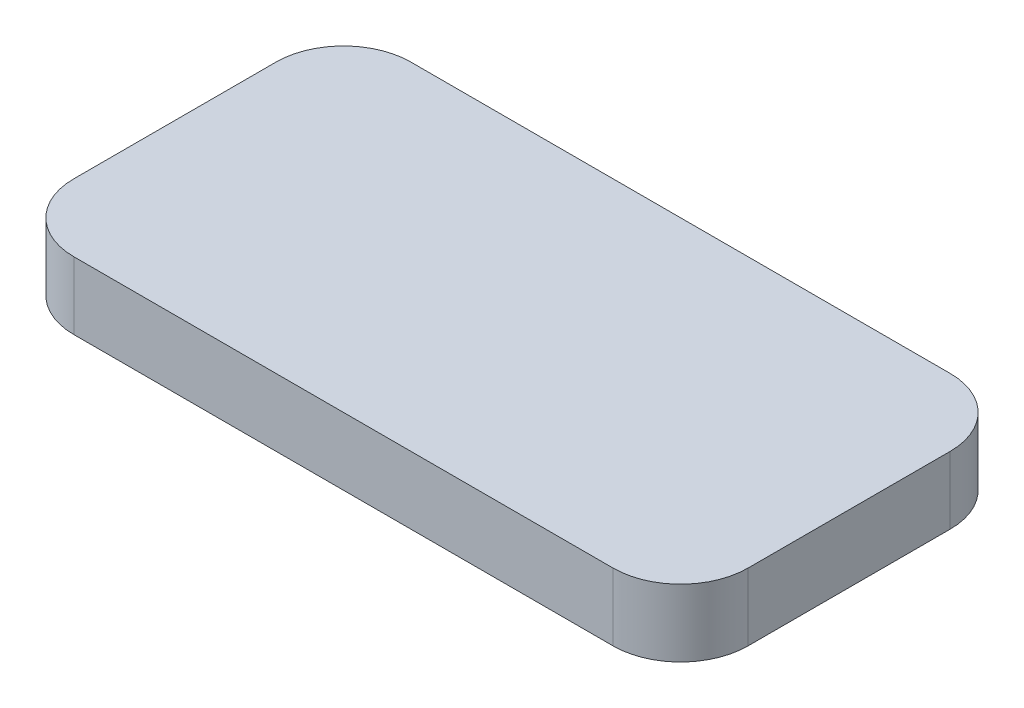
ISO-10303-21;
HEADER;
FILE_DESCRIPTION(('STEP AP214'),'2;1');
FILE_NAME('part.step','',(''),(''),'','','');
FILE_SCHEMA(('AUTOMOTIVE_DESIGN { 1 0 10303 214 1 1 1 1 }'));
ENDSEC;
DATA;
#1=APPLICATION_CONTEXT('core data for automotive mechanical design processes');
#2=APPLICATION_PROTOCOL_DEFINITION('international standard','automotive_design',2000,#1);
#3=PRODUCT_CONTEXT('',#1,'mechanical');
#4=PRODUCT('Part','Part','',(#3));
#5=PRODUCT_RELATED_PRODUCT_CATEGORY('part','',(#4));
#6=PRODUCT_DEFINITION_FORMATION('','',#4);
#7=PRODUCT_DEFINITION_CONTEXT('part definition',#1,'design');
#8=PRODUCT_DEFINITION('design','',#6,#7);
#9=PRODUCT_DEFINITION_SHAPE('','',#8);
#10=(LENGTH_UNIT() NAMED_UNIT(*) SI_UNIT(.MILLI.,.METRE.));
#11=(NAMED_UNIT(*) PLANE_ANGLE_UNIT() SI_UNIT($,.RADIAN.));
#12=(NAMED_UNIT(*) SI_UNIT($,.STERADIAN.) SOLID_ANGLE_UNIT());
#13=UNCERTAINTY_MEASURE_WITH_UNIT(LENGTH_MEASURE(1.E-05),#10,'distance_accuracy_value','');
#14=(GEOMETRIC_REPRESENTATION_CONTEXT(3) GLOBAL_UNCERTAINTY_ASSIGNED_CONTEXT((#13)) GLOBAL_UNIT_ASSIGNED_CONTEXT((#10,
#11,#12)) REPRESENTATION_CONTEXT('',''));
#15=CARTESIAN_POINT('',(0.,0.,0.));
#16=DIRECTION('',(0.,0.,1.));
#17=DIRECTION('',(1.,0.,0.));
#18=AXIS2_PLACEMENT_3D('',#15,#16,#17);
#19=CARTESIAN_POINT('',(50.,10.,25.));
#20=DIRECTION('',(-1.,0.,0.));
#21=DIRECTION('',(0.,0.,1.));
#22=AXIS2_PLACEMENT_3D('',#19,#20,#21);
#23=PLANE('',#22);
#24=DIRECTION('',(0.,0.,-1.));
#25=VECTOR('',#24,1.);
#26=CARTESIAN_POINT('',(50.,0.,25.));
#27=LINE('',#26,#25);
#28=CARTESIAN_POINT('',(50.,0.,15.));
#29=VERTEX_POINT('',#28);
#30=CARTESIAN_POINT('',(50.,0.,-15.));
#31=VERTEX_POINT('',#30);
#32=EDGE_CURVE('E140',#29,#31,#27,.T.);
#33=ORIENTED_EDGE('',*,*,#32,.T.);
#34=DIRECTION('',(0.,-1.,0.));
#35=VECTOR('',#34,1.);
#36=CARTESIAN_POINT('',(50.,10.,-15.));
#37=LINE('',#36,#35);
#38=CARTESIAN_POINT('',(50.,10.,-15.));
#39=VERTEX_POINT('',#38);
#40=EDGE_CURVE('E174',#31,#39,#37,.F.);
#41=ORIENTED_EDGE('',*,*,#40,.T.);
#42=DIRECTION('',(0.,0.,-1.));
#43=VECTOR('',#42,1.);
#44=CARTESIAN_POINT('',(50.,10.,25.));
#45=LINE('',#44,#43);
#46=CARTESIAN_POINT('',(50.,10.,15.));
#47=VERTEX_POINT('',#46);
#48=EDGE_CURVE('E138',#47,#39,#45,.T.);
#49=ORIENTED_EDGE('',*,*,#48,.F.);
#50=DIRECTION('',(0.,-1.,0.));
#51=VECTOR('',#50,1.);
#52=CARTESIAN_POINT('',(50.,10.,15.));
#53=LINE('',#52,#51);
#54=EDGE_CURVE('E170',#47,#29,#53,.T.);
#55=ORIENTED_EDGE('',*,*,#54,.T.);
#56=EDGE_LOOP('',(#33,#41,#49,#55));
#57=FACE_BOUND('',#56,.T.);
#58=ADVANCED_FACE('F39',(#57),#23,.F.);
#59=CARTESIAN_POINT('',(-50.,10.,-25.));
#60=DIRECTION('',(0.,0.,1.));
#61=DIRECTION('',(1.,0.,0.));
#62=AXIS2_PLACEMENT_3D('',#59,#60,#61);
#63=PLANE('',#62);
#64=DIRECTION('',(-1.,0.,0.));
#65=VECTOR('',#64,1.);
#66=CARTESIAN_POINT('',(-50.,0.,-25.));
#67=LINE('',#66,#65);
#68=CARTESIAN_POINT('',(40.,0.,-25.));
#69=VERTEX_POINT('',#68);
#70=CARTESIAN_POINT('',(-40.,0.,-25.));
#71=VERTEX_POINT('',#70);
#72=EDGE_CURVE('E134',#69,#71,#67,.T.);
#73=ORIENTED_EDGE('',*,*,#72,.T.);
#74=DIRECTION('',(0.,-1.,0.));
#75=VECTOR('',#74,1.);
#76=CARTESIAN_POINT('',(-40.,10.,-25.));
#77=LINE('',#76,#75);
#78=CARTESIAN_POINT('',(-40.,10.,-25.));
#79=VERTEX_POINT('',#78);
#80=EDGE_CURVE('E110',#71,#79,#77,.F.);
#81=ORIENTED_EDGE('',*,*,#80,.T.);
#82=DIRECTION('',(-1.,0.,0.));
#83=VECTOR('',#82,1.);
#84=CARTESIAN_POINT('',(-50.,10.,-25.));
#85=LINE('',#84,#83);
#86=CARTESIAN_POINT('',(40.,10.,-25.));
#87=VERTEX_POINT('',#86);
#88=EDGE_CURVE('E193',#87,#79,#85,.T.);
#89=ORIENTED_EDGE('',*,*,#88,.F.);
#90=DIRECTION('',(0.,-1.,0.));
#91=VECTOR('',#90,1.);
#92=CARTESIAN_POINT('',(40.,10.,-25.));
#93=LINE('',#92,#91);
#94=EDGE_CURVE('E116',#87,#69,#93,.T.);
#95=ORIENTED_EDGE('',*,*,#94,.T.);
#96=EDGE_LOOP('',(#73,#81,#89,#95));
#97=FACE_BOUND('',#96,.T.);
#98=ADVANCED_FACE('F214',(#97),#63,.F.);
#99=CARTESIAN_POINT('',(-50.,10.,25.));
#100=DIRECTION('',(1.,0.,0.));
#101=DIRECTION('',(0.,0.,-1.));
#102=AXIS2_PLACEMENT_3D('',#99,#100,#101);
#103=PLANE('',#102);
#104=DIRECTION('',(0.,0.,1.));
#105=VECTOR('',#104,1.);
#106=CARTESIAN_POINT('',(-50.,10.,25.));
#107=LINE('',#106,#105);
#108=CARTESIAN_POINT('',(-50.,10.,-15.));
#109=VERTEX_POINT('',#108);
#110=CARTESIAN_POINT('',(-50.,10.,15.));
#111=VERTEX_POINT('',#110);
#112=EDGE_CURVE('E125',#109,#111,#107,.T.);
#113=ORIENTED_EDGE('',*,*,#112,.F.);
#114=DIRECTION('',(0.,-1.,0.));
#115=VECTOR('',#114,1.);
#116=CARTESIAN_POINT('',(-50.,10.,-15.));
#117=LINE('',#116,#115);
#118=CARTESIAN_POINT('',(-50.,0.,-15.));
#119=VERTEX_POINT('',#118);
#120=EDGE_CURVE('E109',#109,#119,#117,.T.);
#121=ORIENTED_EDGE('',*,*,#120,.T.);
#122=DIRECTION('',(0.,0.,1.));
#123=VECTOR('',#122,1.);
#124=CARTESIAN_POINT('',(-50.,0.,25.));
#125=LINE('',#124,#123);
#126=CARTESIAN_POINT('',(-50.,0.,15.));
#127=VERTEX_POINT('',#126);
#128=EDGE_CURVE('E123',#119,#127,#125,.T.);
#129=ORIENTED_EDGE('',*,*,#128,.T.);
#130=DIRECTION('',(0.,-1.,0.));
#131=VECTOR('',#130,1.);
#132=CARTESIAN_POINT('',(-50.,10.,15.));
#133=LINE('',#132,#131);
#134=EDGE_CURVE('E128',#127,#111,#133,.F.);
#135=ORIENTED_EDGE('',*,*,#134,.T.);
#136=EDGE_LOOP('',(#113,#121,#129,#135));
#137=FACE_BOUND('',#136,.T.);
#138=ADVANCED_FACE('F122',(#137),#103,.F.);
#139=CARTESIAN_POINT('',(-50.,10.,25.));
#140=DIRECTION('',(0.,0.,-1.));
#141=DIRECTION('',(-1.,0.,0.));
#142=AXIS2_PLACEMENT_3D('',#139,#140,#141);
#143=PLANE('',#142);
#144=DIRECTION('',(1.,0.,0.));
#145=VECTOR('',#144,1.);
#146=CARTESIAN_POINT('',(-50.,0.,25.));
#147=LINE('',#146,#145);
#148=CARTESIAN_POINT('',(-40.,0.,25.));
#149=VERTEX_POINT('',#148);
#150=CARTESIAN_POINT('',(40.,0.,25.));
#151=VERTEX_POINT('',#150);
#152=EDGE_CURVE('E133',#149,#151,#147,.T.);
#153=ORIENTED_EDGE('',*,*,#152,.T.);
#154=DIRECTION('',(0.,-1.,0.));
#155=VECTOR('',#154,1.);
#156=CARTESIAN_POINT('',(40.,10.,25.));
#157=LINE('',#156,#155);
#158=CARTESIAN_POINT('',(40.,10.,25.));
#159=VERTEX_POINT('',#158);
#160=EDGE_CURVE('E11',#151,#159,#157,.F.);
#161=ORIENTED_EDGE('',*,*,#160,.T.);
#162=DIRECTION('',(1.,0.,0.));
#163=VECTOR('',#162,1.);
#164=CARTESIAN_POINT('',(-50.,10.,25.));
#165=LINE('',#164,#163);
#166=CARTESIAN_POINT('',(-40.,10.,25.));
#167=VERTEX_POINT('',#166);
#168=EDGE_CURVE('E145',#167,#159,#165,.T.);
#169=ORIENTED_EDGE('',*,*,#168,.F.);
#170=DIRECTION('',(0.,-1.,0.));
#171=VECTOR('',#170,1.);
#172=CARTESIAN_POINT('',(-40.,10.,25.));
#173=LINE('',#172,#171);
#174=EDGE_CURVE('E48',#167,#149,#173,.T.);
#175=ORIENTED_EDGE('',*,*,#174,.T.);
#176=EDGE_LOOP('',(#153,#161,#169,#175));
#177=FACE_BOUND('',#176,.T.);
#178=ADVANCED_FACE('F179',(#177),#143,.F.);
#179=CARTESIAN_POINT('',(0.,10.,0.));
#180=DIRECTION('',(0.,-1.,0.));
#181=DIRECTION('',(0.,0.,-1.));
#182=AXIS2_PLACEMENT_3D('',#179,#180,#181);
#183=PLANE('',#182);
#184=ORIENTED_EDGE('',*,*,#88,.T.);
#185=CARTESIAN_POINT('',(-40.,10.,-15.));
#186=DIRECTION('',(0.,-1.,0.));
#187=DIRECTION('',(0.,0.,-1.));
#188=AXIS2_PLACEMENT_3D('',#185,#186,#187);
#189=CIRCLE('',#188,10.);
#190=EDGE_CURVE('E167',#79,#109,#189,.F.);
#191=ORIENTED_EDGE('',*,*,#190,.T.);
#192=ORIENTED_EDGE('',*,*,#112,.T.);
#193=CARTESIAN_POINT('',(-40.,10.,15.));
#194=DIRECTION('',(0.,-1.,0.));
#195=DIRECTION('',(0.,0.,-1.));
#196=AXIS2_PLACEMENT_3D('',#193,#194,#195);
#197=CIRCLE('',#196,10.);
#198=EDGE_CURVE('E60',#111,#167,#197,.F.);
#199=ORIENTED_EDGE('',*,*,#198,.T.);
#200=ORIENTED_EDGE('',*,*,#168,.T.);
#201=CARTESIAN_POINT('',(40.,10.,15.));
#202=DIRECTION('',(0.,-1.,0.));
#203=DIRECTION('',(0.,0.,-1.));
#204=AXIS2_PLACEMENT_3D('',#201,#202,#203);
#205=CIRCLE('',#204,10.);
#206=EDGE_CURVE('E161',#159,#47,#205,.F.);
#207=ORIENTED_EDGE('',*,*,#206,.T.);
#208=ORIENTED_EDGE('',*,*,#48,.T.);
#209=CARTESIAN_POINT('',(40.,10.,-15.));
#210=DIRECTION('',(0.,-1.,0.));
#211=DIRECTION('',(0.,0.,-1.));
#212=AXIS2_PLACEMENT_3D('',#209,#210,#211);
#213=CIRCLE('',#212,10.);
#214=EDGE_CURVE('E164',#39,#87,#213,.F.);
#215=ORIENTED_EDGE('',*,*,#214,.T.);
#216=EDGE_LOOP('',(#184,#191,#192,#199,#200,#207,#208,#215));
#217=FACE_BOUND('',#216,.T.);
#218=ADVANCED_FACE('F203',(#217),#183,.F.);
#219=CARTESIAN_POINT('',(0.,0.,0.));
#220=DIRECTION('',(0.,-1.,0.));
#221=DIRECTION('',(0.,0.,-1.));
#222=AXIS2_PLACEMENT_3D('',#219,#220,#221);
#223=PLANE('',#222);
#224=ORIENTED_EDGE('',*,*,#128,.F.);
#225=CARTESIAN_POINT('',(-40.,0.,-15.));
#226=DIRECTION('',(0.,-1.,0.));
#227=DIRECTION('',(0.,0.,-1.));
#228=AXIS2_PLACEMENT_3D('',#225,#226,#227);
#229=CIRCLE('',#228,10.);
#230=EDGE_CURVE('E105',#119,#71,#229,.T.);
#231=ORIENTED_EDGE('',*,*,#230,.T.);
#232=ORIENTED_EDGE('',*,*,#72,.F.);
#233=CARTESIAN_POINT('',(40.,0.,-15.));
#234=DIRECTION('',(0.,-1.,0.));
#235=DIRECTION('',(0.,0.,-1.));
#236=AXIS2_PLACEMENT_3D('',#233,#234,#235);
#237=CIRCLE('',#236,10.);
#238=EDGE_CURVE('E117',#69,#31,#237,.T.);
#239=ORIENTED_EDGE('',*,*,#238,.T.);
#240=ORIENTED_EDGE('',*,*,#32,.F.);
#241=CARTESIAN_POINT('',(40.,0.,15.));
#242=DIRECTION('',(0.,-1.,0.));
#243=DIRECTION('',(0.,0.,-1.));
#244=AXIS2_PLACEMENT_3D('',#241,#242,#243);
#245=CIRCLE('',#244,10.);
#246=EDGE_CURVE('E149',#29,#151,#245,.T.);
#247=ORIENTED_EDGE('',*,*,#246,.T.);
#248=ORIENTED_EDGE('',*,*,#152,.F.);
#249=CARTESIAN_POINT('',(-40.,0.,15.));
#250=DIRECTION('',(0.,-1.,0.));
#251=DIRECTION('',(0.,0.,-1.));
#252=AXIS2_PLACEMENT_3D('',#249,#250,#251);
#253=CIRCLE('',#252,10.);
#254=EDGE_CURVE('E127',#149,#127,#253,.T.);
#255=ORIENTED_EDGE('',*,*,#254,.T.);
#256=EDGE_LOOP('',(#224,#231,#232,#239,#240,#247,#248,#255));
#257=FACE_BOUND('',#256,.T.);
#258=ADVANCED_FACE('F130',(#257),#223,.T.);
#259=CARTESIAN_POINT('',(-40.,10.,-15.));
#260=DIRECTION('',(0.,-1.,0.));
#261=DIRECTION('',(0.,0.,-1.));
#262=AXIS2_PLACEMENT_3D('',#259,#260,#261);
#263=CYLINDRICAL_SURFACE('',#262,10.);
#264=ORIENTED_EDGE('',*,*,#190,.F.);
#265=ORIENTED_EDGE('',*,*,#80,.F.);
#266=ORIENTED_EDGE('',*,*,#230,.F.);
#267=ORIENTED_EDGE('',*,*,#120,.F.);
#268=EDGE_LOOP('',(#264,#265,#266,#267));
#269=FACE_BOUND('',#268,.T.);
#270=ADVANCED_FACE('F108',(#269),#263,.T.);
#271=CARTESIAN_POINT('',(40.,10.,-15.));
#272=DIRECTION('',(0.,-1.,0.));
#273=DIRECTION('',(0.,0.,-1.));
#274=AXIS2_PLACEMENT_3D('',#271,#272,#273);
#275=CYLINDRICAL_SURFACE('',#274,10.);
#276=ORIENTED_EDGE('',*,*,#214,.F.);
#277=ORIENTED_EDGE('',*,*,#40,.F.);
#278=ORIENTED_EDGE('',*,*,#238,.F.);
#279=ORIENTED_EDGE('',*,*,#94,.F.);
#280=EDGE_LOOP('',(#276,#277,#278,#279));
#281=FACE_BOUND('',#280,.T.);
#282=ADVANCED_FACE('F225',(#281),#275,.T.);
#283=CARTESIAN_POINT('',(40.,10.,15.));
#284=DIRECTION('',(0.,-1.,0.));
#285=DIRECTION('',(0.,0.,-1.));
#286=AXIS2_PLACEMENT_3D('',#283,#284,#285);
#287=CYLINDRICAL_SURFACE('',#286,10.);
#288=ORIENTED_EDGE('',*,*,#206,.F.);
#289=ORIENTED_EDGE('',*,*,#160,.F.);
#290=ORIENTED_EDGE('',*,*,#246,.F.);
#291=ORIENTED_EDGE('',*,*,#54,.F.);
#292=EDGE_LOOP('',(#288,#289,#290,#291));
#293=FACE_BOUND('',#292,.T.);
#294=ADVANCED_FACE('F186',(#293),#287,.T.);
#295=CARTESIAN_POINT('',(-40.,10.,15.));
#296=DIRECTION('',(0.,-1.,0.));
#297=DIRECTION('',(0.,0.,-1.));
#298=AXIS2_PLACEMENT_3D('',#295,#296,#297);
#299=CYLINDRICAL_SURFACE('',#298,10.);
#300=ORIENTED_EDGE('',*,*,#198,.F.);
#301=ORIENTED_EDGE('',*,*,#134,.F.);
#302=ORIENTED_EDGE('',*,*,#254,.F.);
#303=ORIENTED_EDGE('',*,*,#174,.F.);
#304=EDGE_LOOP('',(#300,#301,#302,#303));
#305=FACE_BOUND('',#304,.T.);
#306=ADVANCED_FACE('F41',(#305),#299,.T.);
#307=CLOSED_SHELL('',(#58,#98,#138,#178,#218,#258,#270,#282,#294,#306));
#308=MANIFOLD_SOLID_BREP('B2',#307);
#309=ADVANCED_BREP_SHAPE_REPRESENTATION('',(#18,#308),#14);
#310=SHAPE_DEFINITION_REPRESENTATION(#9,#309);
ENDSEC;
END-ISO-10303-21;
